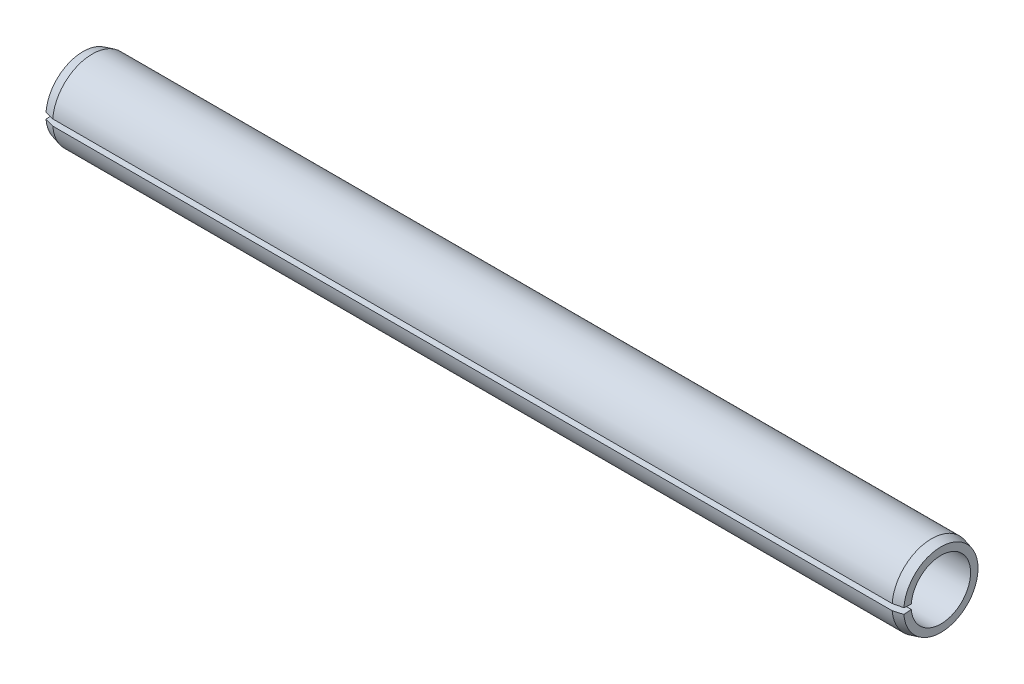
ISO-10303-21;
HEADER;
FILE_DESCRIPTION(('STEP AP214'),'2;1');
FILE_NAME('part.step','',(''),(''),'','','');
FILE_SCHEMA(('AUTOMOTIVE_DESIGN { 1 0 10303 214 1 1 1 1 }'));
ENDSEC;
DATA;
#1=APPLICATION_CONTEXT('core data for automotive mechanical design processes');
#2=APPLICATION_PROTOCOL_DEFINITION('international standard','automotive_design',2000,#1);
#3=PRODUCT_CONTEXT('',#1,'mechanical');
#4=PRODUCT('Part','Part','',(#3));
#5=PRODUCT_RELATED_PRODUCT_CATEGORY('part','',(#4));
#6=PRODUCT_DEFINITION_FORMATION('','',#4);
#7=PRODUCT_DEFINITION_CONTEXT('part definition',#1,'design');
#8=PRODUCT_DEFINITION('design','',#6,#7);
#9=PRODUCT_DEFINITION_SHAPE('','',#8);
#10=(LENGTH_UNIT() NAMED_UNIT(*) SI_UNIT(.MILLI.,.METRE.));
#11=(NAMED_UNIT(*) PLANE_ANGLE_UNIT() SI_UNIT($,.RADIAN.));
#12=(NAMED_UNIT(*) SI_UNIT($,.STERADIAN.) SOLID_ANGLE_UNIT());
#13=UNCERTAINTY_MEASURE_WITH_UNIT(LENGTH_MEASURE(1.E-05),#10,'distance_accuracy_value','');
#14=(GEOMETRIC_REPRESENTATION_CONTEXT(3) GLOBAL_UNCERTAINTY_ASSIGNED_CONTEXT((#13)) GLOBAL_UNIT_ASSIGNED_CONTEXT((#10,
#11,#12)) REPRESENTATION_CONTEXT('',''));
#15=CARTESIAN_POINT('',(0.,0.,0.));
#16=DIRECTION('',(0.,0.,1.));
#17=DIRECTION('',(1.,0.,0.));
#18=AXIS2_PLACEMENT_3D('',#15,#16,#17);
#19=CARTESIAN_POINT('',(0.,2.8125,0.));
#20=DIRECTION('',(1.,0.,0.));
#21=DIRECTION('',(0.,0.,-1.));
#22=AXIS2_PLACEMENT_3D('',#19,#20,#21);
#23=PLANE('',#22);
#24=DIRECTION('',(0.,0.0784590957278456,0.996917333733128));
#25=VECTOR('',#24,1.);
#26=CARTESIAN_POINT('',(0.,0.,0.));
#27=LINE('',#26,#25);
#28=CARTESIAN_POINT('',(0.,0.176532965387653,2.24306400089954));
#29=VERTEX_POINT('',#28);
#30=CARTESIAN_POINT('',(0.,0.220666206734566,2.80383000112442));
#31=VERTEX_POINT('',#30);
#32=EDGE_CURVE('E88',#29,#31,#27,.T.);
#33=ORIENTED_EDGE('',*,*,#32,.T.);
#34=CARTESIAN_POINT('',(0.,0.,0.));
#35=DIRECTION('',(-1.,0.,0.));
#36=DIRECTION('',(0.,0.,1.));
#37=AXIS2_PLACEMENT_3D('',#34,#35,#36);
#38=CIRCLE('',#37,2.8125);
#39=CARTESIAN_POINT('',(0.,-0.220666206734566,2.80383000112442));
#40=VERTEX_POINT('',#39);
#41=EDGE_CURVE('E106',#31,#40,#38,.T.);
#42=ORIENTED_EDGE('',*,*,#41,.T.);
#43=DIRECTION('',(0.,-0.0784590957278456,0.996917333733128));
#44=VECTOR('',#43,1.);
#45=CARTESIAN_POINT('',(0.,0.,0.));
#46=LINE('',#45,#44);
#47=CARTESIAN_POINT('',(0.,-0.176532965387653,2.24306400089954));
#48=VERTEX_POINT('',#47);
#49=EDGE_CURVE('E60',#48,#40,#46,.T.);
#50=ORIENTED_EDGE('',*,*,#49,.F.);
#51=CARTESIAN_POINT('',(0.,0.,0.));
#52=DIRECTION('',(-1.,0.,0.));
#53=DIRECTION('',(0.,0.,1.));
#54=AXIS2_PLACEMENT_3D('',#51,#52,#53);
#55=CIRCLE('',#54,2.25);
#56=EDGE_CURVE('E103',#29,#48,#55,.T.);
#57=ORIENTED_EDGE('',*,*,#56,.F.);
#58=EDGE_LOOP('',(#33,#42,#50,#57));
#59=FACE_BOUND('',#58,.T.);
#60=ADVANCED_FACE('F39',(#59),#23,.F.);
#61=CARTESIAN_POINT('',(-9.52499999999999,0.,0.));
#62=DIRECTION('',(-1.,0.,0.));
#63=DIRECTION('',(0.,0.,1.));
#64=AXIS2_PLACEMENT_3D('',#61,#62,#63);
#65=CYLINDRICAL_SURFACE('',#64,2.25);
#66=DIRECTION('',(-1.,0.,0.));
#67=VECTOR('',#66,1.);
#68=CARTESIAN_POINT('',(-9.52499999999999,0.176532965387653,2.24306400089954));
#69=LINE('',#68,#67);
#70=CARTESIAN_POINT('',(65.,0.176532965387653,2.24306400089954));
#71=VERTEX_POINT('',#70);
#72=EDGE_CURVE('E91',#29,#71,#69,.F.);
#73=ORIENTED_EDGE('',*,*,#72,.F.);
#74=ORIENTED_EDGE('',*,*,#56,.T.);
#75=DIRECTION('',(-1.,0.,0.));
#76=VECTOR('',#75,1.);
#77=CARTESIAN_POINT('',(-9.52499999999999,-0.176532965387653,2.24306400089954));
#78=LINE('',#77,#76);
#79=CARTESIAN_POINT('',(65.,-0.176532965387653,2.24306400089954));
#80=VERTEX_POINT('',#79);
#81=EDGE_CURVE('E124',#48,#80,#78,.F.);
#82=ORIENTED_EDGE('',*,*,#81,.T.);
#83=CARTESIAN_POINT('',(65.,0.,0.));
#84=DIRECTION('',(-1.,0.,0.));
#85=DIRECTION('',(0.,0.,1.));
#86=AXIS2_PLACEMENT_3D('',#83,#84,#85);
#87=CIRCLE('',#86,2.25);
#88=EDGE_CURVE('E105',#71,#80,#87,.T.);
#89=ORIENTED_EDGE('',*,*,#88,.F.);
#90=EDGE_LOOP('',(#73,#74,#82,#89));
#91=FACE_BOUND('',#90,.T.);
#92=ADVANCED_FACE('F101',(#91),#65,.F.);
#93=CARTESIAN_POINT('',(65.,2.25,0.));
#94=DIRECTION('',(-1.,0.,0.));
#95=DIRECTION('',(0.,0.,1.));
#96=AXIS2_PLACEMENT_3D('',#93,#94,#95);
#97=PLANE('',#96);
#98=DIRECTION('',(0.,0.0784590957278456,0.996917333733128));
#99=VECTOR('',#98,1.);
#100=CARTESIAN_POINT('',(65.,0.,0.));
#101=LINE('',#100,#99);
#102=CARTESIAN_POINT('',(65.,0.220666206734566,2.80383000112442));
#103=VERTEX_POINT('',#102);
#104=EDGE_CURVE('E133',#71,#103,#101,.T.);
#105=ORIENTED_EDGE('',*,*,#104,.F.);
#106=ORIENTED_EDGE('',*,*,#88,.T.);
#107=DIRECTION('',(0.,-0.0784590957278456,0.996917333733128));
#108=VECTOR('',#107,1.);
#109=CARTESIAN_POINT('',(65.,0.,0.));
#110=LINE('',#109,#108);
#111=CARTESIAN_POINT('',(65.,-0.220666206734566,2.80383000112442));
#112=VERTEX_POINT('',#111);
#113=EDGE_CURVE('E132',#80,#112,#110,.T.);
#114=ORIENTED_EDGE('',*,*,#113,.T.);
#115=CARTESIAN_POINT('',(65.,0.,0.));
#116=DIRECTION('',(-1.,0.,0.));
#117=DIRECTION('',(0.,0.,1.));
#118=AXIS2_PLACEMENT_3D('',#115,#116,#117);
#119=CIRCLE('',#118,2.8125);
#120=EDGE_CURVE('E110',#103,#112,#119,.T.);
#121=ORIENTED_EDGE('',*,*,#120,.F.);
#122=EDGE_LOOP('',(#105,#106,#114,#121));
#123=FACE_BOUND('',#122,.T.);
#124=ADVANCED_FACE('F143',(#123),#97,.F.);
#125=CARTESIAN_POINT('',(65.,0.,0.));
#126=DIRECTION('',(-1.,0.,0.));
#127=DIRECTION('',(0.,0.,1.));
#128=AXIS2_PLACEMENT_3D('',#125,#126,#127);
#129=CONICAL_SURFACE('',#128,2.8125,0.261713502401214);
#130=DIRECTION('',(-0.965948051503243,0.0203001992788451,0.257938488222149));
#131=VECTOR('',#130,1.);
#132=CARTESIAN_POINT('',(75.4999999999996,0.,0.));
#133=LINE('',#132,#131);
#134=CARTESIAN_POINT('',(64.3,0.235377287183537,2.99075200119939));
#135=VERTEX_POINT('',#134);
#136=EDGE_CURVE('E107',#103,#135,#133,.T.);
#137=ORIENTED_EDGE('',*,*,#136,.F.);
#138=ORIENTED_EDGE('',*,*,#120,.T.);
#139=DIRECTION('',(-0.965948051503243,-0.0203001992788451,0.257938488222149));
#140=VECTOR('',#139,1.);
#141=CARTESIAN_POINT('',(75.4999999999996,0.,0.));
#142=LINE('',#141,#140);
#143=CARTESIAN_POINT('',(64.3,-0.235377287183537,2.99075200119939));
#144=VERTEX_POINT('',#143);
#145=EDGE_CURVE('E126',#112,#144,#142,.T.);
#146=ORIENTED_EDGE('',*,*,#145,.T.);
#147=CARTESIAN_POINT('',(64.3,0.,0.));
#148=DIRECTION('',(-1.,0.,0.));
#149=DIRECTION('',(0.,0.,1.));
#150=AXIS2_PLACEMENT_3D('',#147,#148,#149);
#151=CIRCLE('',#150,3.00000000000001);
#152=EDGE_CURVE('E115',#135,#144,#151,.T.);
#153=ORIENTED_EDGE('',*,*,#152,.F.);
#154=EDGE_LOOP('',(#137,#138,#146,#153));
#155=FACE_BOUND('',#154,.T.);
#156=ADVANCED_FACE('F142',(#155),#129,.T.);
#157=CARTESIAN_POINT('',(-9.52499999999999,0.,0.));
#158=DIRECTION('',(-1.,0.,0.));
#159=DIRECTION('',(0.,0.,1.));
#160=AXIS2_PLACEMENT_3D('',#157,#158,#159);
#161=CYLINDRICAL_SURFACE('',#160,3.);
#162=DIRECTION('',(-1.,0.,0.));
#163=VECTOR('',#162,1.);
#164=CARTESIAN_POINT('',(-9.52499999999999,0.235377287183537,2.99075200119939));
#165=LINE('',#164,#163);
#166=CARTESIAN_POINT('',(0.699999999999999,0.235377287183537,2.99075200119938));
#167=VERTEX_POINT('',#166);
#168=EDGE_CURVE('E52',#135,#167,#165,.T.);
#169=ORIENTED_EDGE('',*,*,#168,.F.);
#170=ORIENTED_EDGE('',*,*,#152,.T.);
#171=DIRECTION('',(-1.,0.,0.));
#172=VECTOR('',#171,1.);
#173=CARTESIAN_POINT('',(-9.52499999999999,-0.235377287183537,2.99075200119939));
#174=LINE('',#173,#172);
#175=CARTESIAN_POINT('',(0.699999999999999,-0.235377287183537,2.99075200119938));
#176=VERTEX_POINT('',#175);
#177=EDGE_CURVE('E129',#144,#176,#174,.T.);
#178=ORIENTED_EDGE('',*,*,#177,.T.);
#179=CARTESIAN_POINT('',(0.699999999999999,0.,0.));
#180=DIRECTION('',(-1.,0.,0.));
#181=DIRECTION('',(0.,0.,1.));
#182=AXIS2_PLACEMENT_3D('',#179,#180,#181);
#183=CIRCLE('',#182,3.);
#184=EDGE_CURVE('E118',#167,#176,#183,.T.);
#185=ORIENTED_EDGE('',*,*,#184,.F.);
#186=EDGE_LOOP('',(#169,#170,#178,#185));
#187=FACE_BOUND('',#186,.T.);
#188=ADVANCED_FACE('F146',(#187),#161,.T.);
#189=CARTESIAN_POINT('',(0.699999999999999,0.,0.));
#190=DIRECTION('',(1.,0.,0.));
#191=DIRECTION('',(0.,0.,-1.));
#192=AXIS2_PLACEMENT_3D('',#189,#190,#191);
#193=CONICAL_SURFACE('',#192,3.,0.261713502401206);
#194=DIRECTION('',(-0.965948051503245,-0.0203001992788444,-0.257938488222141));
#195=VECTOR('',#194,1.);
#196=CARTESIAN_POINT('',(-10.5,0.,0.));
#197=LINE('',#196,#195);
#198=EDGE_CURVE('E11',#167,#31,#197,.T.);
#199=ORIENTED_EDGE('',*,*,#198,.F.);
#200=ORIENTED_EDGE('',*,*,#184,.T.);
#201=DIRECTION('',(-0.965948051503245,0.0203001992788444,-0.257938488222141));
#202=VECTOR('',#201,1.);
#203=CARTESIAN_POINT('',(-10.5,0.,0.));
#204=LINE('',#203,#202);
#205=EDGE_CURVE('E46',#176,#40,#204,.T.);
#206=ORIENTED_EDGE('',*,*,#205,.T.);
#207=ORIENTED_EDGE('',*,*,#41,.F.);
#208=EDGE_LOOP('',(#199,#200,#206,#207));
#209=FACE_BOUND('',#208,.T.);
#210=ADVANCED_FACE('F149',(#209),#193,.T.);
#211=CARTESIAN_POINT('',(65.,0.,0.));
#212=DIRECTION('',(0.,-0.996917333733128,-0.0784590957278456));
#213=DIRECTION('',(0.,0.0784590957278456,-0.996917333733128));
#214=AXIS2_PLACEMENT_3D('',#211,#212,#213);
#215=PLANE('',#214);
#216=ORIENTED_EDGE('',*,*,#49,.T.);
#217=ORIENTED_EDGE('',*,*,#205,.F.);
#218=ORIENTED_EDGE('',*,*,#177,.F.);
#219=ORIENTED_EDGE('',*,*,#145,.F.);
#220=ORIENTED_EDGE('',*,*,#113,.F.);
#221=ORIENTED_EDGE('',*,*,#81,.F.);
#222=EDGE_LOOP('',(#216,#217,#218,#219,#220,#221));
#223=FACE_BOUND('',#222,.T.);
#224=ADVANCED_FACE('F144',(#223),#215,.F.);
#225=CARTESIAN_POINT('',(65.,0.,0.));
#226=DIRECTION('',(0.,-0.996917333733128,0.0784590957278456));
#227=DIRECTION('',(0.,-0.0784590957278456,-0.996917333733128));
#228=AXIS2_PLACEMENT_3D('',#225,#226,#227);
#229=PLANE('',#228);
#230=ORIENTED_EDGE('',*,*,#72,.T.);
#231=ORIENTED_EDGE('',*,*,#104,.T.);
#232=ORIENTED_EDGE('',*,*,#136,.T.);
#233=ORIENTED_EDGE('',*,*,#168,.T.);
#234=ORIENTED_EDGE('',*,*,#198,.T.);
#235=ORIENTED_EDGE('',*,*,#32,.F.);
#236=EDGE_LOOP('',(#230,#231,#232,#233,#234,#235));
#237=FACE_BOUND('',#236,.T.);
#238=ADVANCED_FACE('F90',(#237),#229,.T.);
#239=CLOSED_SHELL('',(#60,#92,#124,#156,#188,#210,#224,#238));
#240=MANIFOLD_SOLID_BREP('B2',#239);
#241=ADVANCED_BREP_SHAPE_REPRESENTATION('',(#18,#240),#14);
#242=SHAPE_DEFINITION_REPRESENTATION(#9,#241);
ENDSEC;
END-ISO-10303-21;
